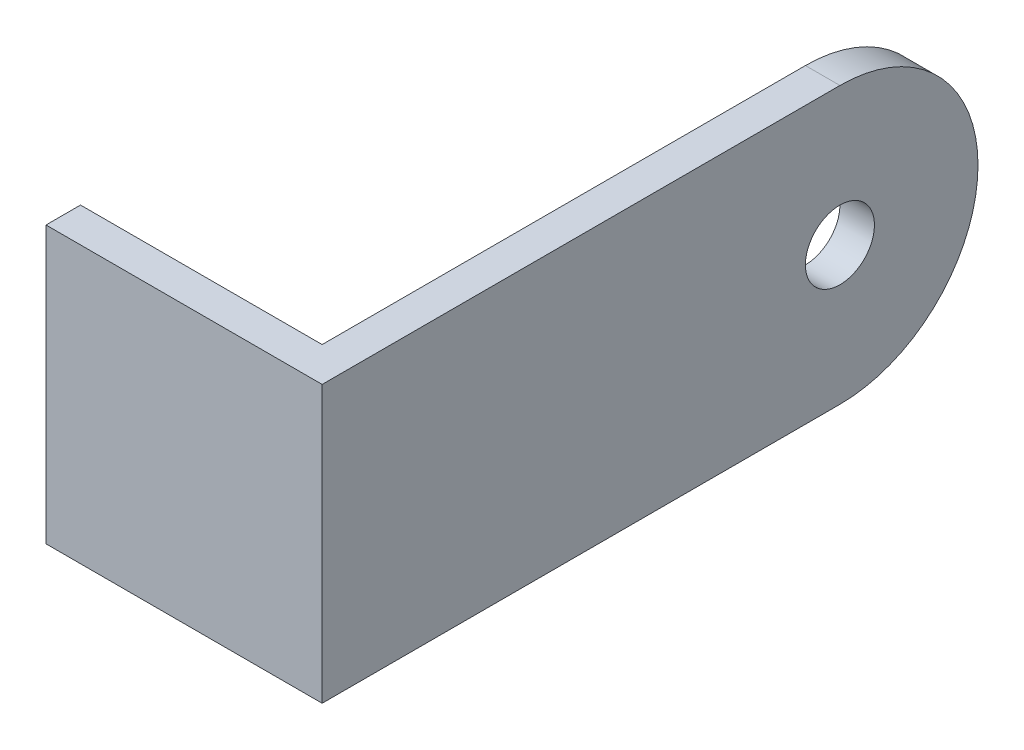
ISO-10303-21;
HEADER;
FILE_DESCRIPTION(('STEP AP214'),'2;1');
FILE_NAME('part.step','',(''),(''),'','','');
FILE_SCHEMA(('AUTOMOTIVE_DESIGN { 1 0 10303 214 1 1 1 1 }'));
ENDSEC;
DATA;
#1=APPLICATION_CONTEXT('core data for automotive mechanical design processes');
#2=APPLICATION_PROTOCOL_DEFINITION('international standard','automotive_design',2000,#1);
#3=PRODUCT_CONTEXT('',#1,'mechanical');
#4=PRODUCT('Part','Part','',(#3));
#5=PRODUCT_RELATED_PRODUCT_CATEGORY('part','',(#4));
#6=PRODUCT_DEFINITION_FORMATION('','',#4);
#7=PRODUCT_DEFINITION_CONTEXT('part definition',#1,'design');
#8=PRODUCT_DEFINITION('design','',#6,#7);
#9=PRODUCT_DEFINITION_SHAPE('','',#8);
#10=(LENGTH_UNIT() NAMED_UNIT(*) SI_UNIT(.MILLI.,.METRE.));
#11=(NAMED_UNIT(*) PLANE_ANGLE_UNIT() SI_UNIT($,.RADIAN.));
#12=(NAMED_UNIT(*) SI_UNIT($,.STERADIAN.) SOLID_ANGLE_UNIT());
#13=UNCERTAINTY_MEASURE_WITH_UNIT(LENGTH_MEASURE(1.E-05),#10,'distance_accuracy_value','');
#14=(GEOMETRIC_REPRESENTATION_CONTEXT(3) GLOBAL_UNCERTAINTY_ASSIGNED_CONTEXT((#13)) GLOBAL_UNIT_ASSIGNED_CONTEXT((#10,
#11,#12)) REPRESENTATION_CONTEXT('',''));
#15=CARTESIAN_POINT('',(0.,0.,0.));
#16=DIRECTION('',(0.,0.,1.));
#17=DIRECTION('',(1.,0.,0.));
#18=AXIS2_PLACEMENT_3D('',#15,#16,#17);
#19=CARTESIAN_POINT('',(-56.0452075753447,20.,81.5810616153932));
#20=DIRECTION('',(-1.,0.,0.));
#21=DIRECTION('',(0.,0.,1.));
#22=AXIS2_PLACEMENT_3D('',#19,#20,#21);
#23=PLANE('',#22);
#24=CARTESIAN_POINT('',(-56.0452075753447,0.,6.58106161539313));
#25=DIRECTION('',(-1.,0.,0.));
#26=DIRECTION('',(0.,0.,1.));
#27=AXIS2_PLACEMENT_3D('',#24,#25,#26);
#28=CIRCLE('',#27,5.);
#29=CARTESIAN_POINT('',(-56.0452075753447,0.,11.5810616153931));
#30=VERTEX_POINT('',#29);
#31=EDGE_CURVE('E136',#30,#30,#28,.T.);
#32=ORIENTED_EDGE('',*,*,#31,.T.);
#33=EDGE_LOOP('',(#32));
#34=FACE_BOUND('',#33,.T.);
#35=DIRECTION('',(0.,0.,-1.));
#36=VECTOR('',#35,1.);
#37=CARTESIAN_POINT('',(-56.0452075753447,-20.,81.5810616153932));
#38=LINE('',#37,#36);
#39=CARTESIAN_POINT('',(-56.0452075753447,-20.,81.5810616153932));
#40=VERTEX_POINT('',#39);
#41=CARTESIAN_POINT('',(-56.0452075753447,-20.,6.58106161539315));
#42=VERTEX_POINT('',#41);
#43=EDGE_CURVE('E133',#40,#42,#38,.T.);
#44=ORIENTED_EDGE('',*,*,#43,.T.);
#45=CARTESIAN_POINT('',(-56.0452075753447,0.,6.58106161539315));
#46=DIRECTION('',(-1.,0.,0.));
#47=DIRECTION('',(0.,0.,1.));
#48=AXIS2_PLACEMENT_3D('',#45,#46,#47);
#49=CIRCLE('',#48,20.);
#50=CARTESIAN_POINT('',(-56.0452075753447,0.,-13.4189383846069));
#51=VERTEX_POINT('',#50);
#52=EDGE_CURVE('E11',#42,#51,#49,.F.);
#53=ORIENTED_EDGE('',*,*,#52,.T.);
#54=CARTESIAN_POINT('',(-56.0452075753447,0.,6.58106161539315));
#55=DIRECTION('',(-1.,0.,0.));
#56=DIRECTION('',(0.,0.,1.));
#57=AXIS2_PLACEMENT_3D('',#54,#55,#56);
#58=CIRCLE('',#57,20.);
#59=CARTESIAN_POINT('',(-56.0452075753447,20.,6.58106161539315));
#60=VERTEX_POINT('',#59);
#61=EDGE_CURVE('E166',#51,#60,#58,.F.);
#62=ORIENTED_EDGE('',*,*,#61,.T.);
#63=DIRECTION('',(0.,0.,-1.));
#64=VECTOR('',#63,1.);
#65=CARTESIAN_POINT('',(-56.0452075753447,20.,81.5810616153932));
#66=LINE('',#65,#64);
#67=CARTESIAN_POINT('',(-56.0452075753447,20.,81.5810616153932));
#68=VERTEX_POINT('',#67);
#69=EDGE_CURVE('E108',#68,#60,#66,.T.);
#70=ORIENTED_EDGE('',*,*,#69,.F.);
#71=DIRECTION('',(0.,-1.,0.));
#72=VECTOR('',#71,1.);
#73=CARTESIAN_POINT('',(-56.0452075753447,20.,81.5810616153932));
#74=LINE('',#73,#72);
#75=EDGE_CURVE('E132',#68,#40,#74,.T.);
#76=ORIENTED_EDGE('',*,*,#75,.T.);
#77=EDGE_LOOP('',(#44,#53,#62,#70,#76));
#78=FACE_BOUND('',#77,.T.);
#79=ADVANCED_FACE('F39',(#34,#78),#23,.F.);
#80=CARTESIAN_POINT('',(-61.0452075753447,20.,-13.4189383846069));
#81=DIRECTION('',(1.,0.,0.));
#82=DIRECTION('',(0.,0.,-1.));
#83=AXIS2_PLACEMENT_3D('',#80,#81,#82);
#84=PLANE('',#83);
#85=CARTESIAN_POINT('',(-61.0452075753447,0.,6.58106161539313));
#86=DIRECTION('',(-1.,0.,0.));
#87=DIRECTION('',(0.,0.,1.));
#88=AXIS2_PLACEMENT_3D('',#85,#86,#87);
#89=CIRCLE('',#88,5.);
#90=CARTESIAN_POINT('',(-61.0452075753447,0.,11.5810616153931));
#91=VERTEX_POINT('',#90);
#92=EDGE_CURVE('E219',#91,#91,#89,.T.);
#93=ORIENTED_EDGE('',*,*,#92,.F.);
#94=EDGE_LOOP('',(#93));
#95=FACE_BOUND('',#94,.T.);
#96=CARTESIAN_POINT('',(-61.0452075753447,0.,6.58106161539315));
#97=DIRECTION('',(1.,0.,0.));
#98=DIRECTION('',(0.,0.,-1.));
#99=AXIS2_PLACEMENT_3D('',#96,#97,#98);
#100=CIRCLE('',#99,20.);
#101=CARTESIAN_POINT('',(-61.0452075753447,20.,6.58106161539314));
#102=VERTEX_POINT('',#101);
#103=CARTESIAN_POINT('',(-61.0452075753447,0.,-13.4189383846069));
#104=VERTEX_POINT('',#103);
#105=EDGE_CURVE('E159',#102,#104,#100,.F.);
#106=ORIENTED_EDGE('',*,*,#105,.T.);
#107=CARTESIAN_POINT('',(-61.0452075753447,0.,6.58106161539315));
#108=DIRECTION('',(1.,0.,0.));
#109=DIRECTION('',(0.,0.,-1.));
#110=AXIS2_PLACEMENT_3D('',#107,#108,#109);
#111=CIRCLE('',#110,20.);
#112=CARTESIAN_POINT('',(-61.0452075753447,-20.,6.58106161539314));
#113=VERTEX_POINT('',#112);
#114=EDGE_CURVE('E62',#104,#113,#111,.F.);
#115=ORIENTED_EDGE('',*,*,#114,.T.);
#116=DIRECTION('',(0.,0.,1.));
#117=VECTOR('',#116,1.);
#118=CARTESIAN_POINT('',(-61.0452075753447,-20.,-13.4189383846069));
#119=LINE('',#118,#117);
#120=CARTESIAN_POINT('',(-61.0452075753447,-20.,76.5810616153931));
#121=VERTEX_POINT('',#120);
#122=EDGE_CURVE('E113',#113,#121,#119,.T.);
#123=ORIENTED_EDGE('',*,*,#122,.T.);
#124=DIRECTION('',(0.,-1.,0.));
#125=VECTOR('',#124,1.);
#126=CARTESIAN_POINT('',(-61.0452075753447,20.,76.5810616153931));
#127=LINE('',#126,#125);
#128=CARTESIAN_POINT('',(-61.0452075753447,20.,76.5810616153931));
#129=VERTEX_POINT('',#128);
#130=EDGE_CURVE('E111',#129,#121,#127,.T.);
#131=ORIENTED_EDGE('',*,*,#130,.F.);
#132=DIRECTION('',(0.,0.,1.));
#133=VECTOR('',#132,1.);
#134=CARTESIAN_POINT('',(-61.0452075753447,20.,-13.4189383846069));
#135=LINE('',#134,#133);
#136=EDGE_CURVE('E98',#102,#129,#135,.T.);
#137=ORIENTED_EDGE('',*,*,#136,.F.);
#138=EDGE_LOOP('',(#106,#115,#123,#131,#137));
#139=FACE_BOUND('',#138,.T.);
#140=ADVANCED_FACE('F112',(#95,#139),#84,.F.);
#141=CARTESIAN_POINT('',(-61.0452075753447,20.,76.5810616153931));
#142=DIRECTION('',(0.,0.,1.));
#143=DIRECTION('',(1.,0.,0.));
#144=AXIS2_PLACEMENT_3D('',#141,#142,#143);
#145=PLANE('',#144);
#146=DIRECTION('',(-1.,0.,0.));
#147=VECTOR('',#146,1.);
#148=CARTESIAN_POINT('',(-61.0452075753447,-20.,76.5810616153931));
#149=LINE('',#148,#147);
#150=CARTESIAN_POINT('',(-96.0452075753447,-20.,76.5810616153931));
#151=VERTEX_POINT('',#150);
#152=EDGE_CURVE('E139',#121,#151,#149,.T.);
#153=ORIENTED_EDGE('',*,*,#152,.T.);
#154=DIRECTION('',(0.,-1.,0.));
#155=VECTOR('',#154,1.);
#156=CARTESIAN_POINT('',(-96.0452075753447,20.,76.5810616153931));
#157=LINE('',#156,#155);
#158=CARTESIAN_POINT('',(-96.0452075753447,20.,76.5810616153931));
#159=VERTEX_POINT('',#158);
#160=EDGE_CURVE('E117',#159,#151,#157,.T.);
#161=ORIENTED_EDGE('',*,*,#160,.F.);
#162=DIRECTION('',(-1.,0.,0.));
#163=VECTOR('',#162,1.);
#164=CARTESIAN_POINT('',(-61.0452075753447,20.,76.5810616153931));
#165=LINE('',#164,#163);
#166=EDGE_CURVE('E103',#129,#159,#165,.T.);
#167=ORIENTED_EDGE('',*,*,#166,.F.);
#168=ORIENTED_EDGE('',*,*,#130,.T.);
#169=EDGE_LOOP('',(#153,#161,#167,#168));
#170=FACE_BOUND('',#169,.T.);
#171=ADVANCED_FACE('F119',(#170),#145,.F.);
#172=CARTESIAN_POINT('',(-96.0452075753447,20.,76.5810616153931));
#173=DIRECTION('',(1.,0.,0.));
#174=DIRECTION('',(0.,0.,-1.));
#175=AXIS2_PLACEMENT_3D('',#172,#173,#174);
#176=PLANE('',#175);
#177=DIRECTION('',(0.,0.,1.));
#178=VECTOR('',#177,1.);
#179=CARTESIAN_POINT('',(-96.0452075753447,-20.,76.5810616153931));
#180=LINE('',#179,#178);
#181=CARTESIAN_POINT('',(-96.0452075753447,-20.,81.5810616153932));
#182=VERTEX_POINT('',#181);
#183=EDGE_CURVE('E142',#151,#182,#180,.T.);
#184=ORIENTED_EDGE('',*,*,#183,.T.);
#185=DIRECTION('',(0.,-1.,0.));
#186=VECTOR('',#185,1.);
#187=CARTESIAN_POINT('',(-96.0452075753447,20.,81.5810616153932));
#188=LINE('',#187,#186);
#189=CARTESIAN_POINT('',(-96.0452075753447,20.,81.5810616153932));
#190=VERTEX_POINT('',#189);
#191=EDGE_CURVE('E151',#190,#182,#188,.T.);
#192=ORIENTED_EDGE('',*,*,#191,.F.);
#193=DIRECTION('',(0.,0.,1.));
#194=VECTOR('',#193,1.);
#195=CARTESIAN_POINT('',(-96.0452075753447,20.,76.5810616153931));
#196=LINE('',#195,#194);
#197=EDGE_CURVE('E123',#159,#190,#196,.T.);
#198=ORIENTED_EDGE('',*,*,#197,.F.);
#199=ORIENTED_EDGE('',*,*,#160,.T.);
#200=EDGE_LOOP('',(#184,#192,#198,#199));
#201=FACE_BOUND('',#200,.T.);
#202=ADVANCED_FACE('F199',(#201),#176,.F.);
#203=CARTESIAN_POINT('',(-96.0452075753447,20.,81.5810616153932));
#204=DIRECTION('',(0.,0.,-1.));
#205=DIRECTION('',(-1.,0.,0.));
#206=AXIS2_PLACEMENT_3D('',#203,#204,#205);
#207=PLANE('',#206);
#208=DIRECTION('',(1.,0.,0.));
#209=VECTOR('',#208,1.);
#210=CARTESIAN_POINT('',(-96.0452075753447,-20.,81.5810616153932));
#211=LINE('',#210,#209);
#212=EDGE_CURVE('E145',#182,#40,#211,.T.);
#213=ORIENTED_EDGE('',*,*,#212,.T.);
#214=ORIENTED_EDGE('',*,*,#75,.F.);
#215=DIRECTION('',(1.,0.,0.));
#216=VECTOR('',#215,1.);
#217=CARTESIAN_POINT('',(-96.0452075753447,20.,81.5810616153932));
#218=LINE('',#217,#216);
#219=EDGE_CURVE('E126',#190,#68,#218,.T.);
#220=ORIENTED_EDGE('',*,*,#219,.F.);
#221=ORIENTED_EDGE('',*,*,#191,.T.);
#222=EDGE_LOOP('',(#213,#214,#220,#221));
#223=FACE_BOUND('',#222,.T.);
#224=ADVANCED_FACE('F202',(#223),#207,.F.);
#225=CARTESIAN_POINT('',(0.,20.,0.));
#226=DIRECTION('',(0.,1.,0.));
#227=DIRECTION('',(0.,0.,1.));
#228=AXIS2_PLACEMENT_3D('',#225,#226,#227);
#229=PLANE('',#228);
#230=ORIENTED_EDGE('',*,*,#69,.T.);
#231=DIRECTION('',(-1.,0.,0.));
#232=VECTOR('',#231,1.);
#233=CARTESIAN_POINT('',(-61.0452075753447,20.,6.58106161539315));
#234=LINE('',#233,#232);
#235=EDGE_CURVE('E106',#60,#102,#234,.T.);
#236=ORIENTED_EDGE('',*,*,#235,.T.);
#237=ORIENTED_EDGE('',*,*,#136,.T.);
#238=ORIENTED_EDGE('',*,*,#166,.T.);
#239=ORIENTED_EDGE('',*,*,#197,.T.);
#240=ORIENTED_EDGE('',*,*,#219,.T.);
#241=EDGE_LOOP('',(#230,#236,#237,#238,#239,#240));
#242=FACE_BOUND('',#241,.T.);
#243=ADVANCED_FACE('F101',(#242),#229,.T.);
#244=CARTESIAN_POINT('',(0.,-20.,0.));
#245=DIRECTION('',(0.,1.,0.));
#246=DIRECTION('',(0.,0.,1.));
#247=AXIS2_PLACEMENT_3D('',#244,#245,#246);
#248=PLANE('',#247);
#249=ORIENTED_EDGE('',*,*,#122,.F.);
#250=DIRECTION('',(-1.,0.,0.));
#251=VECTOR('',#250,1.);
#252=CARTESIAN_POINT('',(0.,-20.,6.58106161539315));
#253=LINE('',#252,#251);
#254=EDGE_CURVE('E48',#113,#42,#253,.F.);
#255=ORIENTED_EDGE('',*,*,#254,.T.);
#256=ORIENTED_EDGE('',*,*,#43,.F.);
#257=ORIENTED_EDGE('',*,*,#212,.F.);
#258=ORIENTED_EDGE('',*,*,#183,.F.);
#259=ORIENTED_EDGE('',*,*,#152,.F.);
#260=EDGE_LOOP('',(#249,#255,#256,#257,#258,#259));
#261=FACE_BOUND('',#260,.T.);
#262=ADVANCED_FACE('F207',(#261),#248,.F.);
#263=CARTESIAN_POINT('',(-21.0452075753447,0.,6.58106161539312));
#264=DIRECTION('',(-1.,0.,0.));
#265=DIRECTION('',(0.,0.,1.));
#266=AXIS2_PLACEMENT_3D('',#263,#264,#265);
#267=CYLINDRICAL_SURFACE('',#266,5.);
#268=ORIENTED_EDGE('',*,*,#92,.T.);
#269=EDGE_LOOP('',(#268));
#270=FACE_BOUND('',#269,.T.);
#271=ORIENTED_EDGE('',*,*,#31,.F.);
#272=EDGE_LOOP('',(#271));
#273=FACE_BOUND('',#272,.T.);
#274=ADVANCED_FACE('F186',(#270,#273),#267,.F.);
#275=CARTESIAN_POINT('',(0.,0.,6.58106161539315));
#276=DIRECTION('',(1.,0.,0.));
#277=DIRECTION('',(0.,0.,-1.));
#278=AXIS2_PLACEMENT_3D('',#275,#276,#277);
#279=CYLINDRICAL_SURFACE('',#278,20.);
#280=ORIENTED_EDGE('',*,*,#61,.F.);
#281=DIRECTION('',(-1.,0.,0.));
#282=VECTOR('',#281,1.);
#283=CARTESIAN_POINT('',(-56.0452075753447,0.,-13.4189383846069));
#284=LINE('',#283,#282);
#285=EDGE_CURVE('E162',#104,#51,#284,.F.);
#286=ORIENTED_EDGE('',*,*,#285,.F.);
#287=ORIENTED_EDGE('',*,*,#105,.F.);
#288=ORIENTED_EDGE('',*,*,#235,.F.);
#289=EDGE_LOOP('',(#280,#286,#287,#288));
#290=FACE_BOUND('',#289,.T.);
#291=ADVANCED_FACE('F180',(#290),#279,.T.);
#292=CARTESIAN_POINT('',(-56.0452075753447,0.,6.58106161539315));
#293=DIRECTION('',(-1.,0.,0.));
#294=DIRECTION('',(0.,0.,1.));
#295=AXIS2_PLACEMENT_3D('',#292,#293,#294);
#296=CYLINDRICAL_SURFACE('',#295,20.);
#297=ORIENTED_EDGE('',*,*,#52,.F.);
#298=ORIENTED_EDGE('',*,*,#254,.F.);
#299=ORIENTED_EDGE('',*,*,#114,.F.);
#300=ORIENTED_EDGE('',*,*,#285,.T.);
#301=EDGE_LOOP('',(#297,#298,#299,#300));
#302=FACE_BOUND('',#301,.T.);
#303=ADVANCED_FACE('F41',(#302),#296,.T.);
#304=CLOSED_SHELL('',(#79,#140,#171,#202,#224,#243,#262,#274,#291,#303));
#305=MANIFOLD_SOLID_BREP('B2',#304);
#306=ADVANCED_BREP_SHAPE_REPRESENTATION('',(#18,#305),#14);
#307=SHAPE_DEFINITION_REPRESENTATION(#9,#306);
ENDSEC;
END-ISO-10303-21;
